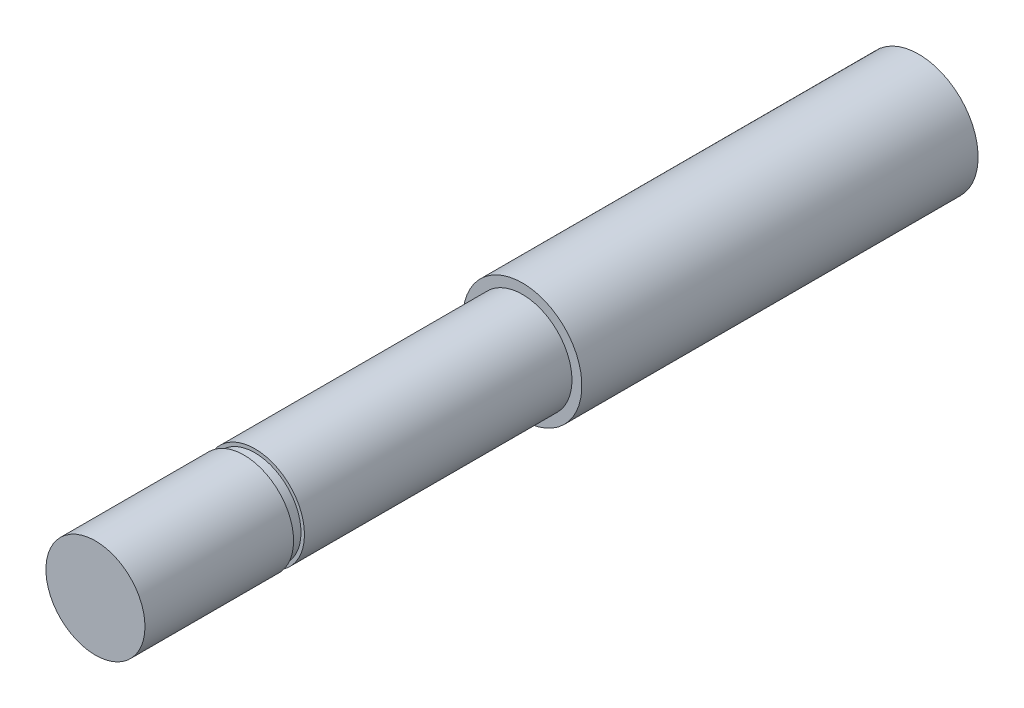
ISO-10303-21;
HEADER;
FILE_DESCRIPTION(('STEP AP214'),'2;1');
FILE_NAME('part.step','',(''),(''),'','','');
FILE_SCHEMA(('AUTOMOTIVE_DESIGN { 1 0 10303 214 1 1 1 1 }'));
ENDSEC;
DATA;
#1=APPLICATION_CONTEXT('core data for automotive mechanical design processes');
#2=APPLICATION_PROTOCOL_DEFINITION('international standard','automotive_design',2000,#1);
#3=PRODUCT_CONTEXT('',#1,'mechanical');
#4=PRODUCT('Part','Part','',(#3));
#5=PRODUCT_RELATED_PRODUCT_CATEGORY('part','',(#4));
#6=PRODUCT_DEFINITION_FORMATION('','',#4);
#7=PRODUCT_DEFINITION_CONTEXT('part definition',#1,'design');
#8=PRODUCT_DEFINITION('design','',#6,#7);
#9=PRODUCT_DEFINITION_SHAPE('','',#8);
#10=(LENGTH_UNIT() NAMED_UNIT(*) SI_UNIT(.MILLI.,.METRE.));
#11=(NAMED_UNIT(*) PLANE_ANGLE_UNIT() SI_UNIT($,.RADIAN.));
#12=(NAMED_UNIT(*) SI_UNIT($,.STERADIAN.) SOLID_ANGLE_UNIT());
#13=UNCERTAINTY_MEASURE_WITH_UNIT(LENGTH_MEASURE(1.E-05),#10,'distance_accuracy_value','');
#14=(GEOMETRIC_REPRESENTATION_CONTEXT(3) GLOBAL_UNCERTAINTY_ASSIGNED_CONTEXT((#13)) GLOBAL_UNIT_ASSIGNED_CONTEXT((#10,
#11,#12)) REPRESENTATION_CONTEXT('',''));
#15=CARTESIAN_POINT('',(0.,0.,0.));
#16=DIRECTION('',(0.,0.,1.));
#17=DIRECTION('',(1.,0.,0.));
#18=AXIS2_PLACEMENT_3D('',#15,#16,#17);
#19=CARTESIAN_POINT('',(0.,0.,27.));
#20=DIRECTION('',(0.,0.,1.));
#21=DIRECTION('',(1.,0.,0.));
#22=AXIS2_PLACEMENT_3D('',#19,#20,#21);
#23=PLANE('',#22);
#24=CARTESIAN_POINT('',(0.,0.,27.));
#25=DIRECTION('',(0.,0.,1.));
#26=DIRECTION('',(1.,0.,0.));
#27=AXIS2_PLACEMENT_3D('',#24,#25,#26);
#28=CIRCLE('',#27,5.);
#29=CARTESIAN_POINT('',(5.,0.,27.));
#30=VERTEX_POINT('',#29);
#31=EDGE_CURVE('E10',#30,#30,#28,.T.);
#32=ORIENTED_EDGE('',*,*,#31,.T.);
#33=EDGE_LOOP('',(#32));
#34=FACE_BOUND('',#33,.T.);
#35=CARTESIAN_POINT('',(0.,0.,27.));
#36=DIRECTION('',(0.,0.,1.));
#37=DIRECTION('',(1.,0.,0.));
#38=AXIS2_PLACEMENT_3D('',#35,#36,#37);
#39=CIRCLE('',#38,4.65);
#40=CARTESIAN_POINT('',(4.65,0.,27.));
#41=VERTEX_POINT('',#40);
#42=EDGE_CURVE('E52',#41,#41,#39,.T.);
#43=ORIENTED_EDGE('',*,*,#42,.F.);
#44=EDGE_LOOP('',(#43));
#45=FACE_BOUND('',#44,.T.);
#46=ADVANCED_FACE('F31',(#34,#45),#23,.T.);
#47=CARTESIAN_POINT('',(0.,0.,27.));
#48=DIRECTION('',(0.,0.,-1.));
#49=DIRECTION('',(-1.,0.,0.));
#50=AXIS2_PLACEMENT_3D('',#47,#48,#49);
#51=CYLINDRICAL_SURFACE('',#50,5.);
#52=ORIENTED_EDGE('',*,*,#31,.F.);
#53=EDGE_LOOP('',(#52));
#54=FACE_BOUND('',#53,.T.);
#55=CARTESIAN_POINT('',(0.,0.,0.));
#56=DIRECTION('',(0.,0.,-1.));
#57=DIRECTION('',(-1.,0.,0.));
#58=AXIS2_PLACEMENT_3D('',#55,#56,#57);
#59=CIRCLE('',#58,5.);
#60=CARTESIAN_POINT('',(-5.,0.,0.));
#61=VERTEX_POINT('',#60);
#62=EDGE_CURVE('E38',#61,#61,#59,.T.);
#63=ORIENTED_EDGE('',*,*,#62,.F.);
#64=EDGE_LOOP('',(#63));
#65=FACE_BOUND('',#64,.T.);
#66=ADVANCED_FACE('F33',(#54,#65),#51,.T.);
#67=CARTESIAN_POINT('',(0.,0.,0.));
#68=DIRECTION('',(0.,0.,-1.));
#69=DIRECTION('',(-1.,0.,0.));
#70=AXIS2_PLACEMENT_3D('',#67,#68,#69);
#71=PLANE('',#70);
#72=CARTESIAN_POINT('',(0.,0.,0.));
#73=DIRECTION('',(0.,0.,-1.));
#74=DIRECTION('',(-1.,0.,0.));
#75=AXIS2_PLACEMENT_3D('',#72,#73,#74);
#76=CIRCLE('',#75,6.);
#77=CARTESIAN_POINT('',(-6.,0.,0.));
#78=VERTEX_POINT('',#77);
#79=EDGE_CURVE('E46',#78,#78,#76,.T.);
#80=ORIENTED_EDGE('',*,*,#79,.F.);
#81=EDGE_LOOP('',(#80));
#82=FACE_BOUND('',#81,.T.);
#83=ORIENTED_EDGE('',*,*,#62,.T.);
#84=EDGE_LOOP('',(#83));
#85=FACE_BOUND('',#84,.T.);
#86=ADVANCED_FACE('F89',(#82,#85),#71,.F.);
#87=CARTESIAN_POINT('',(0.,0.,-40.));
#88=DIRECTION('',(0.,0.,1.));
#89=DIRECTION('',(1.,0.,0.));
#90=AXIS2_PLACEMENT_3D('',#87,#88,#89);
#91=CYLINDRICAL_SURFACE('',#90,6.);
#92=CARTESIAN_POINT('',(0.,0.,-40.));
#93=DIRECTION('',(0.,0.,-1.));
#94=DIRECTION('',(-1.,0.,0.));
#95=AXIS2_PLACEMENT_3D('',#92,#93,#94);
#96=CIRCLE('',#95,6.);
#97=CARTESIAN_POINT('',(-6.,0.,-40.));
#98=VERTEX_POINT('',#97);
#99=EDGE_CURVE('E42',#98,#98,#96,.T.);
#100=ORIENTED_EDGE('',*,*,#99,.F.);
#101=EDGE_LOOP('',(#100));
#102=FACE_BOUND('',#101,.T.);
#103=ORIENTED_EDGE('',*,*,#79,.T.);
#104=EDGE_LOOP('',(#103));
#105=FACE_BOUND('',#104,.T.);
#106=ADVANCED_FACE('F92',(#102,#105),#91,.T.);
#107=CARTESIAN_POINT('',(0.,0.,-40.));
#108=DIRECTION('',(0.,0.,-1.));
#109=DIRECTION('',(-1.,0.,0.));
#110=AXIS2_PLACEMENT_3D('',#107,#108,#109);
#111=PLANE('',#110);
#112=ORIENTED_EDGE('',*,*,#99,.T.);
#113=EDGE_LOOP('',(#112));
#114=FACE_BOUND('',#113,.T.);
#115=ADVANCED_FACE('F81',(#114),#111,.T.);
#116=CARTESIAN_POINT('',(0.,0.,28.1));
#117=DIRECTION('',(0.,0.,-1.));
#118=DIRECTION('',(-1.,0.,0.));
#119=AXIS2_PLACEMENT_3D('',#116,#117,#118);
#120=CYLINDRICAL_SURFACE('',#119,4.65);
#121=CARTESIAN_POINT('',(0.,0.,28.1));
#122=DIRECTION('',(0.,0.,1.));
#123=DIRECTION('',(1.,0.,0.));
#124=AXIS2_PLACEMENT_3D('',#121,#122,#123);
#125=CIRCLE('',#124,4.65);
#126=CARTESIAN_POINT('',(4.65,0.,28.1));
#127=VERTEX_POINT('',#126);
#128=EDGE_CURVE('E50',#127,#127,#125,.T.);
#129=ORIENTED_EDGE('',*,*,#128,.F.);
#130=EDGE_LOOP('',(#129));
#131=FACE_BOUND('',#130,.T.);
#132=ORIENTED_EDGE('',*,*,#42,.T.);
#133=EDGE_LOOP('',(#132));
#134=FACE_BOUND('',#133,.T.);
#135=ADVANCED_FACE('F75',(#131,#134),#120,.T.);
#136=CARTESIAN_POINT('',(0.,0.,28.1));
#137=DIRECTION('',(0.,0.,1.));
#138=DIRECTION('',(1.,0.,0.));
#139=AXIS2_PLACEMENT_3D('',#136,#137,#138);
#140=PLANE('',#139);
#141=CARTESIAN_POINT('',(0.,0.,28.1));
#142=DIRECTION('',(0.,0.,1.));
#143=DIRECTION('',(1.,0.,0.));
#144=AXIS2_PLACEMENT_3D('',#141,#142,#143);
#145=CIRCLE('',#144,5.);
#146=CARTESIAN_POINT('',(5.,0.,28.1));
#147=VERTEX_POINT('',#146);
#148=EDGE_CURVE('E58',#147,#147,#145,.T.);
#149=ORIENTED_EDGE('',*,*,#148,.F.);
#150=EDGE_LOOP('',(#149));
#151=FACE_BOUND('',#150,.T.);
#152=ORIENTED_EDGE('',*,*,#128,.T.);
#153=EDGE_LOOP('',(#152));
#154=FACE_BOUND('',#153,.T.);
#155=ADVANCED_FACE('F69',(#151,#154),#140,.F.);
#156=CARTESIAN_POINT('',(0.,0.,43.1));
#157=DIRECTION('',(0.,0.,-1.));
#158=DIRECTION('',(-1.,0.,0.));
#159=AXIS2_PLACEMENT_3D('',#156,#157,#158);
#160=CYLINDRICAL_SURFACE('',#159,5.);
#161=CARTESIAN_POINT('',(0.,0.,43.1));
#162=DIRECTION('',(0.,0.,1.));
#163=DIRECTION('',(1.,0.,0.));
#164=AXIS2_PLACEMENT_3D('',#161,#162,#163);
#165=CIRCLE('',#164,5.);
#166=CARTESIAN_POINT('',(5.,0.,43.1));
#167=VERTEX_POINT('',#166);
#168=EDGE_CURVE('E55',#167,#167,#165,.T.);
#169=ORIENTED_EDGE('',*,*,#168,.F.);
#170=EDGE_LOOP('',(#169));
#171=FACE_BOUND('',#170,.T.);
#172=ORIENTED_EDGE('',*,*,#148,.T.);
#173=EDGE_LOOP('',(#172));
#174=FACE_BOUND('',#173,.T.);
#175=ADVANCED_FACE('F66',(#171,#174),#160,.T.);
#176=CARTESIAN_POINT('',(0.,0.,43.1));
#177=DIRECTION('',(0.,0.,1.));
#178=DIRECTION('',(1.,0.,0.));
#179=AXIS2_PLACEMENT_3D('',#176,#177,#178);
#180=PLANE('',#179);
#181=ORIENTED_EDGE('',*,*,#168,.T.);
#182=EDGE_LOOP('',(#181));
#183=FACE_BOUND('',#182,.T.);
#184=ADVANCED_FACE('F64',(#183),#180,.T.);
#185=CLOSED_SHELL('',(#46,#66,#86,#106,#115,#135,#155,#175,#184));
#186=MANIFOLD_SOLID_BREP('B2',#185);
#187=ADVANCED_BREP_SHAPE_REPRESENTATION('',(#18,#186),#14);
#188=SHAPE_DEFINITION_REPRESENTATION(#9,#187);
ENDSEC;
END-ISO-10303-21;
